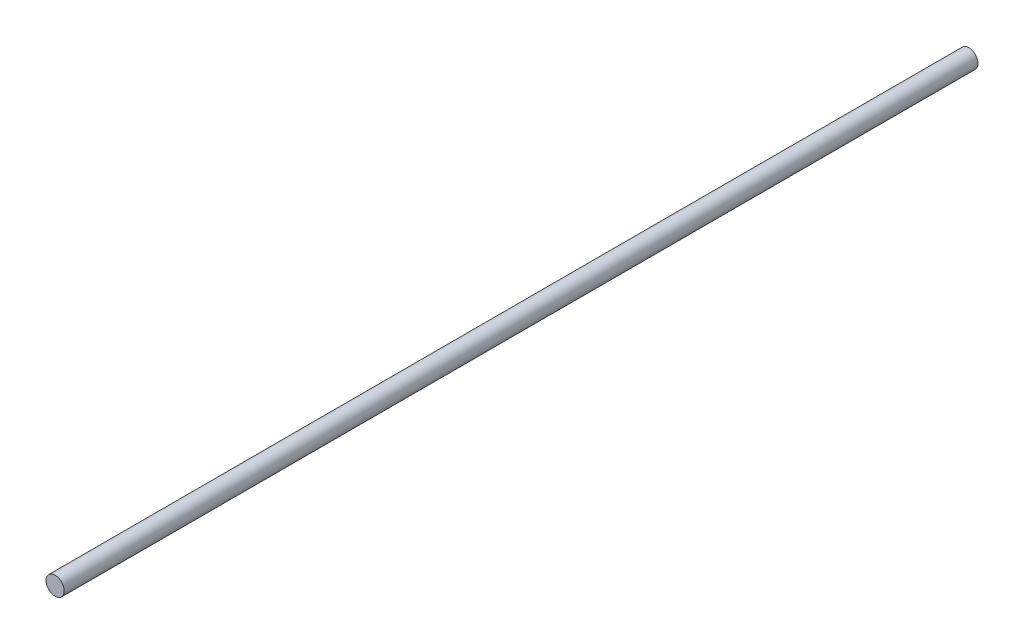
ISO-10303-21;
HEADER;
FILE_DESCRIPTION(('STEP AP214'),'2;1');
FILE_NAME('part.step','',(''),(''),'','','');
FILE_SCHEMA(('AUTOMOTIVE_DESIGN { 1 0 10303 214 1 1 1 1 }'));
ENDSEC;
DATA;
#1=APPLICATION_CONTEXT('core data for automotive mechanical design processes');
#2=APPLICATION_PROTOCOL_DEFINITION('international standard','automotive_design',2000,#1);
#3=PRODUCT_CONTEXT('',#1,'mechanical');
#4=PRODUCT('Part','Part','',(#3));
#5=PRODUCT_RELATED_PRODUCT_CATEGORY('part','',(#4));
#6=PRODUCT_DEFINITION_FORMATION('','',#4);
#7=PRODUCT_DEFINITION_CONTEXT('part definition',#1,'design');
#8=PRODUCT_DEFINITION('design','',#6,#7);
#9=PRODUCT_DEFINITION_SHAPE('','',#8);
#10=(LENGTH_UNIT() NAMED_UNIT(*) SI_UNIT(.MILLI.,.METRE.));
#11=(NAMED_UNIT(*) PLANE_ANGLE_UNIT() SI_UNIT($,.RADIAN.));
#12=(NAMED_UNIT(*) SI_UNIT($,.STERADIAN.) SOLID_ANGLE_UNIT());
#13=UNCERTAINTY_MEASURE_WITH_UNIT(LENGTH_MEASURE(1.E-05),#10,'distance_accuracy_value','');
#14=(GEOMETRIC_REPRESENTATION_CONTEXT(3) GLOBAL_UNCERTAINTY_ASSIGNED_CONTEXT((#13)) GLOBAL_UNIT_ASSIGNED_CONTEXT((#10,
#11,#12)) REPRESENTATION_CONTEXT('',''));
#15=CARTESIAN_POINT('',(0.,0.,0.));
#16=DIRECTION('',(0.,0.,1.));
#17=DIRECTION('',(1.,0.,0.));
#18=AXIS2_PLACEMENT_3D('',#15,#16,#17);
#19=CARTESIAN_POINT('',(0.,0.,1500.));
#20=DIRECTION('',(0.,0.,-1.));
#21=DIRECTION('',(-1.,0.,0.));
#22=AXIS2_PLACEMENT_3D('',#19,#20,#21);
#23=CYLINDRICAL_SURFACE('',#22,15.);
#24=CARTESIAN_POINT('',(0.,0.,1500.));
#25=DIRECTION('',(0.,0.,1.));
#26=DIRECTION('',(1.,0.,0.));
#27=AXIS2_PLACEMENT_3D('',#24,#25,#26);
#28=CIRCLE('',#27,15.);
#29=CARTESIAN_POINT('',(15.,0.,1500.));
#30=VERTEX_POINT('',#29);
#31=EDGE_CURVE('E10',#30,#30,#28,.T.);
#32=ORIENTED_EDGE('',*,*,#31,.F.);
#33=EDGE_LOOP('',(#32));
#34=FACE_BOUND('',#33,.T.);
#35=CARTESIAN_POINT('',(0.,0.,0.));
#36=DIRECTION('',(0.,0.,1.));
#37=DIRECTION('',(1.,0.,0.));
#38=AXIS2_PLACEMENT_3D('',#35,#36,#37);
#39=CIRCLE('',#38,15.);
#40=CARTESIAN_POINT('',(15.,0.,0.));
#41=VERTEX_POINT('',#40);
#42=EDGE_CURVE('E36',#41,#41,#39,.T.);
#43=ORIENTED_EDGE('',*,*,#42,.T.);
#44=EDGE_LOOP('',(#43));
#45=FACE_BOUND('',#44,.T.);
#46=ADVANCED_FACE('F33',(#34,#45),#23,.T.);
#47=CARTESIAN_POINT('',(0.,0.,1500.));
#48=DIRECTION('',(0.,0.,1.));
#49=DIRECTION('',(1.,0.,0.));
#50=AXIS2_PLACEMENT_3D('',#47,#48,#49);
#51=PLANE('',#50);
#52=ORIENTED_EDGE('',*,*,#31,.T.);
#53=EDGE_LOOP('',(#52));
#54=FACE_BOUND('',#53,.T.);
#55=ADVANCED_FACE('F48',(#54),#51,.T.);
#56=CARTESIAN_POINT('',(0.,0.,0.));
#57=DIRECTION('',(0.,0.,1.));
#58=DIRECTION('',(1.,0.,0.));
#59=AXIS2_PLACEMENT_3D('',#56,#57,#58);
#60=PLANE('',#59);
#61=ORIENTED_EDGE('',*,*,#42,.F.);
#62=EDGE_LOOP('',(#61));
#63=FACE_BOUND('',#62,.T.);
#64=ADVANCED_FACE('F46',(#63),#60,.F.);
#65=CLOSED_SHELL('',(#46,#55,#64));
#66=MANIFOLD_SOLID_BREP('B2',#65);
#67=ADVANCED_BREP_SHAPE_REPRESENTATION('',(#18,#66),#14);
#68=SHAPE_DEFINITION_REPRESENTATION(#9,#67);
ENDSEC;
END-ISO-10303-21;
